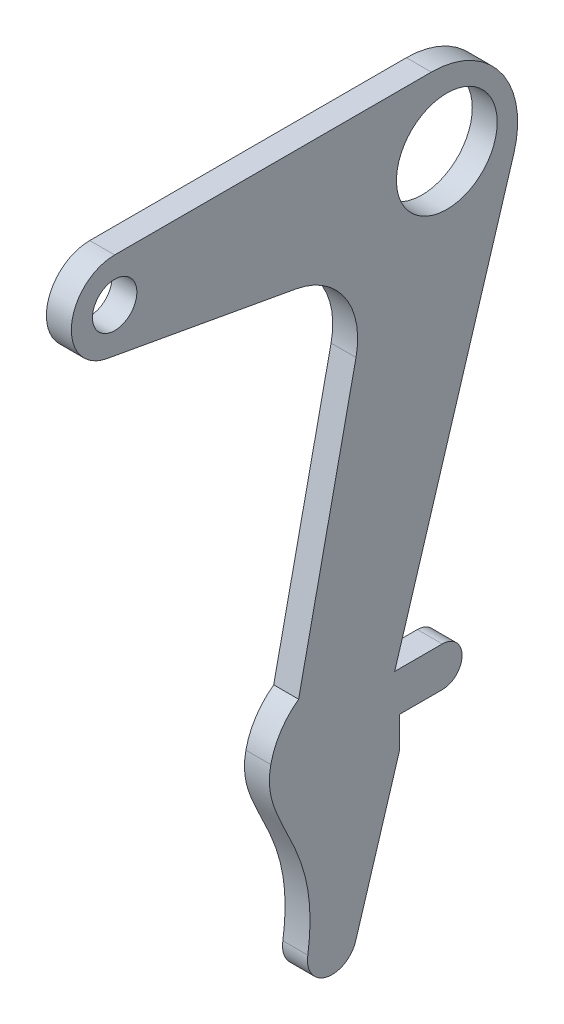
ISO-10303-21;
HEADER;
FILE_DESCRIPTION(('STEP AP214'),'2;1');
FILE_NAME('part.step','',(''),(''),'','','');
FILE_SCHEMA(('AUTOMOTIVE_DESIGN { 1 0 10303 214 1 1 1 1 }'));
ENDSEC;
DATA;
#1=APPLICATION_CONTEXT('core data for automotive mechanical design processes');
#2=APPLICATION_PROTOCOL_DEFINITION('international standard','automotive_design',2000,#1);
#3=PRODUCT_CONTEXT('',#1,'mechanical');
#4=PRODUCT('Part','Part','',(#3));
#5=PRODUCT_RELATED_PRODUCT_CATEGORY('part','',(#4));
#6=PRODUCT_DEFINITION_FORMATION('','',#4);
#7=PRODUCT_DEFINITION_CONTEXT('part definition',#1,'design');
#8=PRODUCT_DEFINITION('design','',#6,#7);
#9=PRODUCT_DEFINITION_SHAPE('','',#8);
#10=(LENGTH_UNIT() NAMED_UNIT(*) SI_UNIT(.MILLI.,.METRE.));
#11=(NAMED_UNIT(*) PLANE_ANGLE_UNIT() SI_UNIT($,.RADIAN.));
#12=(NAMED_UNIT(*) SI_UNIT($,.STERADIAN.) SOLID_ANGLE_UNIT());
#13=UNCERTAINTY_MEASURE_WITH_UNIT(LENGTH_MEASURE(1.E-05),#10,'distance_accuracy_value','');
#14=(GEOMETRIC_REPRESENTATION_CONTEXT(3) GLOBAL_UNCERTAINTY_ASSIGNED_CONTEXT((#13)) GLOBAL_UNIT_ASSIGNED_CONTEXT((#10,
#11,#12)) REPRESENTATION_CONTEXT('',''));
#15=CARTESIAN_POINT('',(0.,0.,0.));
#16=DIRECTION('',(0.,0.,1.));
#17=DIRECTION('',(1.,0.,0.));
#18=AXIS2_PLACEMENT_3D('',#15,#16,#17);
#19=CARTESIAN_POINT('',(2.54,-10.9445470475474,15.1229557204025));
#20=DIRECTION('',(-1.,0.,0.));
#21=DIRECTION('',(0.,0.,1.));
#22=AXIS2_PLACEMENT_3D('',#19,#20,#21);
#23=PLANE('',#22);
#24=CARTESIAN_POINT('',(2.54,1.02415763569521,-1.58018979669472));
#25=DIRECTION('',(1.,0.,0.));
#26=DIRECTION('',(0.,0.,-1.));
#27=AXIS2_PLACEMENT_3D('',#24,#25,#26);
#28=CIRCLE('',#27,5.1308);
#29=CARTESIAN_POINT('',(2.54,1.02415763569521,-6.71098979669473));
#30=VERTEX_POINT('',#29);
#31=EDGE_CURVE('E176',#30,#30,#28,.T.);
#32=ORIENTED_EDGE('',*,*,#31,.F.);
#33=EDGE_LOOP('',(#32));
#34=FACE_BOUND('',#33,.T.);
#35=CARTESIAN_POINT('',(2.54,-10.9445470475474,15.1229557204025));
#36=DIRECTION('',(-1.,0.,0.));
#37=DIRECTION('',(0.,0.,1.));
#38=AXIS2_PLACEMENT_3D('',#35,#36,#37);
#39=CIRCLE('',#38,7.62);
#40=CARTESIAN_POINT('',(2.54,-3.44624236430479,13.7665535391666));
#41=VERTEX_POINT('',#40);
#42=CARTESIAN_POINT('',(2.54,-12.5437586475555,7.67265893044847));
#43=VERTEX_POINT('',#42);
#44=EDGE_CURVE('E206',#41,#43,#39,.T.);
#45=ORIENTED_EDGE('',*,*,#44,.T.);
#46=DIRECTION('',(0.,-0.977729237526779,0.209870288714964));
#47=VECTOR('',#46,1.);
#48=CARTESIAN_POINT('',(2.54,-12.5437586475555,7.67265893044847));
#49=LINE('',#48,#47);
#50=CARTESIAN_POINT('',(2.54,-39.7682423643048,13.5164140708828));
#51=VERTEX_POINT('',#50);
#52=EDGE_CURVE('E114',#43,#51,#49,.T.);
#53=ORIENTED_EDGE('',*,*,#52,.T.);
#54=CARTESIAN_POINT('',(2.54,-45.6317526728369,9.26737306283968));
#55=DIRECTION('',(1.,0.,0.));
#56=DIRECTION('',(0.,0.,1.));
#57=AXIS2_PLACEMENT_3D('',#54,#55,#56);
#58=CIRCLE('',#57,7.24120864402443);
#59=CARTESIAN_POINT('',(2.54,-44.1215673632961,16.3493532207575));
#60=VERTEX_POINT('',#59);
#61=EDGE_CURVE('E242',#51,#60,#58,.T.);
#62=ORIENTED_EDGE('',*,*,#61,.T.);
#63=CARTESIAN_POINT('',(2.54,-44.1215673632961,16.3493532207575));
#64=CARTESIAN_POINT('',(2.54,-49.6498731903993,17.5282277813429));
#65=CARTESIAN_POINT('',(2.54,-52.6752905741128,11.082221768751));
#66=CARTESIAN_POINT('',(2.54,-62.8206542039674,12.581554006208));
#67=B_SPLINE_CURVE_WITH_KNOTS('',3,(#63,#64,#65,#66),.UNSPECIFIED.,.F.,.F.,(4,4),(0.,1.),.UNSPECIFIED.);
#68=CARTESIAN_POINT('',(2.54,-62.8206542039674,12.581554006208));
#69=VERTEX_POINT('',#68);
#70=EDGE_CURVE('E261',#60,#69,#67,.T.);
#71=ORIENTED_EDGE('',*,*,#70,.T.);
#72=CARTESIAN_POINT('',(2.54,-63.2593902703144,10.1055241549973));
#73=DIRECTION('',(1.,0.,0.));
#74=DIRECTION('',(0.,0.,-1.));
#75=AXIS2_PLACEMENT_3D('',#72,#73,#74);
#76=CIRCLE('',#75,2.5146);
#77=CARTESIAN_POINT('',(2.54,-63.9960579975812,7.7012500816846));
#78=VERTEX_POINT('',#77);
#79=EDGE_CURVE('E258',#69,#78,#76,.T.);
#80=ORIENTED_EDGE('',*,*,#79,.T.);
#81=DIRECTION('',(0.,0.956125854335754,-0.292956226543701));
#82=VECTOR('',#81,1.);
#83=CARTESIAN_POINT('',(2.54,-49.5218423643048,3.26636154177543));
#84=LINE('',#83,#82);
#85=CARTESIAN_POINT('',(2.54,-49.5218423643048,3.26636154177543));
#86=VERTEX_POINT('',#85);
#87=EDGE_CURVE('E260',#78,#86,#84,.T.);
#88=ORIENTED_EDGE('',*,*,#87,.T.);
#89=DIRECTION('',(0.,1.,0.));
#90=VECTOR('',#89,1.);
#91=CARTESIAN_POINT('',(2.54,-46.2452423643048,3.26636154177543));
#92=LINE('',#91,#90);
#93=CARTESIAN_POINT('',(2.54,-46.2452423643048,3.26636154177543));
#94=VERTEX_POINT('',#93);
#95=EDGE_CURVE('E263',#86,#94,#92,.T.);
#96=ORIENTED_EDGE('',*,*,#95,.T.);
#97=DIRECTION('',(0.,0.,-1.));
#98=VECTOR('',#97,1.);
#99=CARTESIAN_POINT('',(2.54,-46.2452423643048,-1.11513845822457));
#100=LINE('',#99,#98);
#101=CARTESIAN_POINT('',(2.54,-46.2452423643048,-1.11513845822457));
#102=VERTEX_POINT('',#101);
#103=EDGE_CURVE('E272',#94,#102,#100,.T.);
#104=ORIENTED_EDGE('',*,*,#103,.T.);
#105=CARTESIAN_POINT('',(2.54,-44.2259423643048,-1.11513845822457));
#106=DIRECTION('',(1.,0.,0.));
#107=DIRECTION('',(0.,0.,1.));
#108=AXIS2_PLACEMENT_3D('',#105,#106,#107);
#109=CIRCLE('',#108,2.0193);
#110=CARTESIAN_POINT('',(2.54,-42.2066423643048,-1.11513845822457));
#111=VERTEX_POINT('',#110);
#112=EDGE_CURVE('E274',#102,#111,#109,.T.);
#113=ORIENTED_EDGE('',*,*,#112,.T.);
#114=DIRECTION('',(0.,0.,1.));
#115=VECTOR('',#114,1.);
#116=CARTESIAN_POINT('',(2.54,-42.2066423643048,3.73187382210256));
#117=LINE('',#116,#115);
#118=CARTESIAN_POINT('',(2.54,-42.2066423643048,3.73187382210256));
#119=VERTEX_POINT('',#118);
#120=EDGE_CURVE('E276',#111,#119,#117,.T.);
#121=ORIENTED_EDGE('',*,*,#120,.T.);
#122=DIRECTION('',(0.,0.956125854335754,-0.292956226543701));
#123=VECTOR('',#122,1.);
#124=CARTESIAN_POINT('',(2.54,-2.57700633152745,-8.41061618464278));
#125=LINE('',#124,#123);
#126=CARTESIAN_POINT('',(2.54,-2.57700633152745,-8.41061618464278));
#127=VERTEX_POINT('',#126);
#128=EDGE_CURVE('E278',#119,#127,#125,.T.);
#129=ORIENTED_EDGE('',*,*,#128,.T.);
#130=CARTESIAN_POINT('',(2.54,0.,0.));
#131=DIRECTION('',(1.,0.,0.));
#132=DIRECTION('',(0.,0.,1.));
#133=AXIS2_PLACEMENT_3D('',#130,#131,#132);
#134=CIRCLE('',#133,8.79655763569521);
#135=CARTESIAN_POINT('',(2.54,8.79655763569521,0.));
#136=VERTEX_POINT('',#135);
#137=EDGE_CURVE('E154',#127,#136,#134,.T.);
#138=ORIENTED_EDGE('',*,*,#137,.T.);
#139=DIRECTION('',(0.,0.,1.));
#140=VECTOR('',#139,1.);
#141=CARTESIAN_POINT('',(2.54,8.79655763569521,32.2561923643048));
#142=LINE('',#141,#140);
#143=CARTESIAN_POINT('',(2.54,8.79655763569521,32.2561923643048));
#144=VERTEX_POINT('',#143);
#145=EDGE_CURVE('E148',#136,#144,#142,.T.);
#146=ORIENTED_EDGE('',*,*,#145,.T.);
#147=CARTESIAN_POINT('',(2.54,4.38330763569521,32.2561923643048));
#148=DIRECTION('',(1.,0.,0.));
#149=DIRECTION('',(0.,0.,1.));
#150=AXIS2_PLACEMENT_3D('',#147,#148,#149);
#151=CIRCLE('',#150,4.41325);
#152=CARTESIAN_POINT('',(2.54,0.0405395066505202,33.0417752942706));
#153=VERTEX_POINT('',#152);
#154=EDGE_CURVE('E152',#144,#153,#151,.T.);
#155=ORIENTED_EDGE('',*,*,#154,.T.);
#156=DIRECTION('',(0.,-0.178005535595269,-0.984029485989847));
#157=VECTOR('',#156,1.);
#158=CARTESIAN_POINT('',(2.54,0.0405395066505202,33.0417752942706));
#159=LINE('',#158,#157);
#160=EDGE_CURVE('E50',#153,#41,#159,.T.);
#161=ORIENTED_EDGE('',*,*,#160,.T.);
#162=EDGE_LOOP('',(#45,#53,#62,#71,#80,#88,#96,#104,#113,#121,#129,#138,#146,#155,#161));
#163=FACE_BOUND('',#162,.T.);
#164=CARTESIAN_POINT('',(2.54,4.38330763569521,32.2561923643048));
#165=DIRECTION('',(1.,0.,0.));
#166=DIRECTION('',(0.,0.,-1.));
#167=AXIS2_PLACEMENT_3D('',#164,#165,#166);
#168=CIRCLE('',#167,2.26201088204937);
#169=CARTESIAN_POINT('',(2.54,4.38330763569521,29.9941814822554));
#170=VERTEX_POINT('',#169);
#171=EDGE_CURVE('E321',#170,#170,#168,.T.);
#172=ORIENTED_EDGE('',*,*,#171,.F.);
#173=EDGE_LOOP('',(#172));
#174=FACE_BOUND('',#173,.T.);
#175=ADVANCED_FACE('F33',(#34,#163,#174),#23,.F.);
#176=CARTESIAN_POINT('',(0.,-10.9445470475474,15.1229557204025));
#177=DIRECTION('',(-1.,0.,0.));
#178=DIRECTION('',(0.,0.,1.));
#179=AXIS2_PLACEMENT_3D('',#176,#177,#178);
#180=PLANE('',#179);
#181=CARTESIAN_POINT('',(0.,1.02415763569521,-1.58018979669472));
#182=DIRECTION('',(1.,0.,0.));
#183=DIRECTION('',(0.,0.,-1.));
#184=AXIS2_PLACEMENT_3D('',#181,#182,#183);
#185=CIRCLE('',#184,5.1308);
#186=CARTESIAN_POINT('',(0.,1.02415763569521,-6.71098979669473));
#187=VERTEX_POINT('',#186);
#188=EDGE_CURVE('E326',#187,#187,#185,.T.);
#189=ORIENTED_EDGE('',*,*,#188,.T.);
#190=EDGE_LOOP('',(#189));
#191=FACE_BOUND('',#190,.T.);
#192=CARTESIAN_POINT('',(0.,-10.9445470475474,15.1229557204025));
#193=DIRECTION('',(-1.,0.,0.));
#194=DIRECTION('',(0.,0.,1.));
#195=AXIS2_PLACEMENT_3D('',#192,#193,#194);
#196=CIRCLE('',#195,7.62);
#197=CARTESIAN_POINT('',(0.,-3.44624236430479,13.7665535391666));
#198=VERTEX_POINT('',#197);
#199=CARTESIAN_POINT('',(0.,-12.5437586475555,7.67265893044847));
#200=VERTEX_POINT('',#199);
#201=EDGE_CURVE('E172',#198,#200,#196,.T.);
#202=ORIENTED_EDGE('',*,*,#201,.F.);
#203=DIRECTION('',(0.,-0.178005535595269,-0.984029485989847));
#204=VECTOR('',#203,1.);
#205=CARTESIAN_POINT('',(0.,0.0405395066505202,33.0417752942706));
#206=LINE('',#205,#204);
#207=CARTESIAN_POINT('',(0.,0.0405395066505202,33.0417752942706));
#208=VERTEX_POINT('',#207);
#209=EDGE_CURVE('E106',#208,#198,#206,.T.);
#210=ORIENTED_EDGE('',*,*,#209,.F.);
#211=CARTESIAN_POINT('',(0.,4.38330763569521,32.2561923643048));
#212=DIRECTION('',(1.,0.,0.));
#213=DIRECTION('',(0.,0.,1.));
#214=AXIS2_PLACEMENT_3D('',#211,#212,#213);
#215=CIRCLE('',#214,4.41325);
#216=CARTESIAN_POINT('',(0.,8.79655763569521,32.2561923643048));
#217=VERTEX_POINT('',#216);
#218=EDGE_CURVE('E100',#217,#208,#215,.T.);
#219=ORIENTED_EDGE('',*,*,#218,.F.);
#220=DIRECTION('',(0.,0.,1.));
#221=VECTOR('',#220,1.);
#222=CARTESIAN_POINT('',(0.,8.79655763569521,32.2561923643048));
#223=LINE('',#222,#221);
#224=CARTESIAN_POINT('',(0.,8.79655763569521,0.));
#225=VERTEX_POINT('',#224);
#226=EDGE_CURVE('E162',#225,#217,#223,.T.);
#227=ORIENTED_EDGE('',*,*,#226,.F.);
#228=CARTESIAN_POINT('',(0.,0.,0.));
#229=DIRECTION('',(1.,0.,0.));
#230=DIRECTION('',(0.,0.,1.));
#231=AXIS2_PLACEMENT_3D('',#228,#229,#230);
#232=CIRCLE('',#231,8.79655763569521);
#233=CARTESIAN_POINT('',(0.,-2.57700633152745,-8.41061618464278));
#234=VERTEX_POINT('',#233);
#235=EDGE_CURVE('E201',#234,#225,#232,.T.);
#236=ORIENTED_EDGE('',*,*,#235,.F.);
#237=DIRECTION('',(0.,0.956125854335754,-0.292956226543701));
#238=VECTOR('',#237,1.);
#239=CARTESIAN_POINT('',(0.,-2.57700633152745,-8.41061618464278));
#240=LINE('',#239,#238);
#241=CARTESIAN_POINT('',(0.,-42.2066423643048,3.73187382210256));
#242=VERTEX_POINT('',#241);
#243=EDGE_CURVE('E199',#242,#234,#240,.T.);
#244=ORIENTED_EDGE('',*,*,#243,.F.);
#245=DIRECTION('',(0.,0.,1.));
#246=VECTOR('',#245,1.);
#247=CARTESIAN_POINT('',(0.,-42.2066423643048,3.73187382210256));
#248=LINE('',#247,#246);
#249=CARTESIAN_POINT('',(0.,-42.2066423643048,-1.11513845822457));
#250=VERTEX_POINT('',#249);
#251=EDGE_CURVE('E197',#250,#242,#248,.T.);
#252=ORIENTED_EDGE('',*,*,#251,.F.);
#253=CARTESIAN_POINT('',(0.,-44.2259423643048,-1.11513845822457));
#254=DIRECTION('',(1.,0.,0.));
#255=DIRECTION('',(0.,0.,1.));
#256=AXIS2_PLACEMENT_3D('',#253,#254,#255);
#257=CIRCLE('',#256,2.0193);
#258=CARTESIAN_POINT('',(0.,-46.2452423643048,-1.11513845822457));
#259=VERTEX_POINT('',#258);
#260=EDGE_CURVE('E195',#259,#250,#257,.T.);
#261=ORIENTED_EDGE('',*,*,#260,.F.);
#262=DIRECTION('',(0.,0.,-1.));
#263=VECTOR('',#262,1.);
#264=CARTESIAN_POINT('',(0.,-46.2452423643048,-1.11513845822457));
#265=LINE('',#264,#263);
#266=CARTESIAN_POINT('',(0.,-46.2452423643048,3.26636154177543));
#267=VERTEX_POINT('',#266);
#268=EDGE_CURVE('E193',#267,#259,#265,.T.);
#269=ORIENTED_EDGE('',*,*,#268,.F.);
#270=DIRECTION('',(0.,1.,0.));
#271=VECTOR('',#270,1.);
#272=CARTESIAN_POINT('',(0.,-46.2452423643048,3.26636154177543));
#273=LINE('',#272,#271);
#274=CARTESIAN_POINT('',(0.,-49.5218423643048,3.26636154177543));
#275=VERTEX_POINT('',#274);
#276=EDGE_CURVE('E191',#275,#267,#273,.T.);
#277=ORIENTED_EDGE('',*,*,#276,.F.);
#278=DIRECTION('',(0.,0.956125854335754,-0.292956226543701));
#279=VECTOR('',#278,1.);
#280=CARTESIAN_POINT('',(0.,-49.5218423643048,3.26636154177543));
#281=LINE('',#280,#279);
#282=CARTESIAN_POINT('',(0.,-63.9960579975812,7.7012500816846));
#283=VERTEX_POINT('',#282);
#284=EDGE_CURVE('E189',#283,#275,#281,.T.);
#285=ORIENTED_EDGE('',*,*,#284,.F.);
#286=CARTESIAN_POINT('',(0.,-63.2593902703144,10.1055241549973));
#287=DIRECTION('',(1.,0.,0.));
#288=DIRECTION('',(0.,0.,-1.));
#289=AXIS2_PLACEMENT_3D('',#286,#287,#288);
#290=CIRCLE('',#289,2.5146);
#291=CARTESIAN_POINT('',(0.,-62.8206542039674,12.581554006208));
#292=VERTEX_POINT('',#291);
#293=EDGE_CURVE('E184',#292,#283,#290,.T.);
#294=ORIENTED_EDGE('',*,*,#293,.F.);
#295=CARTESIAN_POINT('',(0.,-44.1215673632961,16.3493532207575));
#296=CARTESIAN_POINT('',(0.,-49.6498731903993,17.5282277813429));
#297=CARTESIAN_POINT('',(0.,-52.6752905741128,11.082221768751));
#298=CARTESIAN_POINT('',(0.,-62.8206542039674,12.581554006208));
#299=B_SPLINE_CURVE_WITH_KNOTS('',3,(#295,#296,#297,#298),.UNSPECIFIED.,.F.,.F.,(4,4),(0.,1.),.UNSPECIFIED.);
#300=CARTESIAN_POINT('',(0.,-44.1215673632961,16.3493532207575));
#301=VERTEX_POINT('',#300);
#302=EDGE_CURVE('E180',#301,#292,#299,.T.);
#303=ORIENTED_EDGE('',*,*,#302,.F.);
#304=CARTESIAN_POINT('',(0.,-45.6317526728369,9.26737306283968));
#305=DIRECTION('',(1.,0.,0.));
#306=DIRECTION('',(0.,0.,1.));
#307=AXIS2_PLACEMENT_3D('',#304,#305,#306);
#308=CIRCLE('',#307,7.24120864402443);
#309=CARTESIAN_POINT('',(0.,-39.7682423643048,13.5164140708828));
#310=VERTEX_POINT('',#309);
#311=EDGE_CURVE('E178',#310,#301,#308,.T.);
#312=ORIENTED_EDGE('',*,*,#311,.F.);
#313=DIRECTION('',(0.,-0.977729237526779,0.209870288714964));
#314=VECTOR('',#313,1.);
#315=CARTESIAN_POINT('',(0.,-12.5437586475555,7.67265893044847));
#316=LINE('',#315,#314);
#317=EDGE_CURVE('E175',#200,#310,#316,.T.);
#318=ORIENTED_EDGE('',*,*,#317,.F.);
#319=EDGE_LOOP('',(#202,#210,#219,#227,#236,#244,#252,#261,#269,#277,#285,#294,#303,#312,#318));
#320=FACE_BOUND('',#319,.T.);
#321=CARTESIAN_POINT('',(0.,4.38330763569521,32.2561923643048));
#322=DIRECTION('',(1.,0.,0.));
#323=DIRECTION('',(0.,0.,-1.));
#324=AXIS2_PLACEMENT_3D('',#321,#322,#323);
#325=CIRCLE('',#324,2.26201088204937);
#326=CARTESIAN_POINT('',(0.,4.38330763569521,29.9941814822554));
#327=VERTEX_POINT('',#326);
#328=EDGE_CURVE('E324',#327,#327,#325,.T.);
#329=ORIENTED_EDGE('',*,*,#328,.T.);
#330=EDGE_LOOP('',(#329));
#331=FACE_BOUND('',#330,.T.);
#332=ADVANCED_FACE('F246',(#191,#320,#331),#180,.T.);
#333=CARTESIAN_POINT('',(2.54,-10.9445470475474,15.1229557204025));
#334=DIRECTION('',(-1.,0.,0.));
#335=DIRECTION('',(0.,0.,1.));
#336=AXIS2_PLACEMENT_3D('',#333,#334,#335);
#337=CYLINDRICAL_SURFACE('',#336,7.62);
#338=ORIENTED_EDGE('',*,*,#201,.T.);
#339=DIRECTION('',(-1.,0.,0.));
#340=VECTOR('',#339,1.);
#341=CARTESIAN_POINT('',(2.54,-12.5437586475555,7.67265893044847));
#342=LINE('',#341,#340);
#343=EDGE_CURVE('E11',#43,#200,#342,.T.);
#344=ORIENTED_EDGE('',*,*,#343,.F.);
#345=ORIENTED_EDGE('',*,*,#44,.F.);
#346=DIRECTION('',(-1.,0.,0.));
#347=VECTOR('',#346,1.);
#348=CARTESIAN_POINT('',(2.54,-3.44624236430479,13.7665535391666));
#349=LINE('',#348,#347);
#350=EDGE_CURVE('E168',#41,#198,#349,.T.);
#351=ORIENTED_EDGE('',*,*,#350,.T.);
#352=EDGE_LOOP('',(#338,#344,#345,#351));
#353=FACE_BOUND('',#352,.T.);
#354=ADVANCED_FACE('F35',(#353),#337,.F.);
#355=CARTESIAN_POINT('',(2.54,-12.5437586475555,7.67265893044847));
#356=DIRECTION('',(0.,-0.209870288714964,-0.977729237526779));
#357=DIRECTION('',(0.,0.977729237526779,-0.209870288714964));
#358=AXIS2_PLACEMENT_3D('',#355,#356,#357);
#359=PLANE('',#358);
#360=ORIENTED_EDGE('',*,*,#317,.T.);
#361=DIRECTION('',(-1.,0.,0.));
#362=VECTOR('',#361,1.);
#363=CARTESIAN_POINT('',(2.54,-39.7682423643048,13.5164140708828));
#364=LINE('',#363,#362);
#365=EDGE_CURVE('E42',#51,#310,#364,.T.);
#366=ORIENTED_EDGE('',*,*,#365,.F.);
#367=ORIENTED_EDGE('',*,*,#52,.F.);
#368=ORIENTED_EDGE('',*,*,#343,.T.);
#369=EDGE_LOOP('',(#360,#366,#367,#368));
#370=FACE_BOUND('',#369,.T.);
#371=ADVANCED_FACE('F449',(#370),#359,.F.);
#372=CARTESIAN_POINT('',(2.54,-45.6317526728369,9.26737306283968));
#373=DIRECTION('',(-1.,0.,0.));
#374=DIRECTION('',(0.,0.,1.));
#375=AXIS2_PLACEMENT_3D('',#372,#373,#374);
#376=CYLINDRICAL_SURFACE('',#375,7.24120864402443);
#377=ORIENTED_EDGE('',*,*,#311,.T.);
#378=DIRECTION('',(-1.,0.,0.));
#379=VECTOR('',#378,1.);
#380=CARTESIAN_POINT('',(2.54,-44.1215673632961,16.3493532207575));
#381=LINE('',#380,#379);
#382=EDGE_CURVE('E234',#60,#301,#381,.T.);
#383=ORIENTED_EDGE('',*,*,#382,.F.);
#384=ORIENTED_EDGE('',*,*,#61,.F.);
#385=ORIENTED_EDGE('',*,*,#365,.T.);
#386=EDGE_LOOP('',(#377,#383,#384,#385));
#387=FACE_BOUND('',#386,.T.);
#388=ADVANCED_FACE('F240',(#387),#376,.T.);
#389=DIRECTION('',(-1.,0.,0.));
#390=VECTOR('',#389,1.);
#391=SURFACE_OF_LINEAR_EXTRUSION('',#67,#390);
#392=ORIENTED_EDGE('',*,*,#302,.T.);
#393=DIRECTION('',(-1.,0.,0.));
#394=VECTOR('',#393,1.);
#395=CARTESIAN_POINT('',(2.54,-62.8206542039674,12.581554006208));
#396=LINE('',#395,#394);
#397=EDGE_CURVE('E231',#69,#292,#396,.T.);
#398=ORIENTED_EDGE('',*,*,#397,.F.);
#399=ORIENTED_EDGE('',*,*,#70,.F.);
#400=ORIENTED_EDGE('',*,*,#382,.T.);
#401=EDGE_LOOP('',(#392,#398,#399,#400));
#402=FACE_BOUND('',#401,.T.);
#403=ADVANCED_FACE('F252',(#402),#391,.F.);
#404=CARTESIAN_POINT('',(2.54,-63.2593902703144,10.1055241549973));
#405=DIRECTION('',(-1.,0.,0.));
#406=DIRECTION('',(0.,0.,1.));
#407=AXIS2_PLACEMENT_3D('',#404,#405,#406);
#408=CYLINDRICAL_SURFACE('',#407,2.5146);
#409=ORIENTED_EDGE('',*,*,#293,.T.);
#410=DIRECTION('',(-1.,0.,0.));
#411=VECTOR('',#410,1.);
#412=CARTESIAN_POINT('',(2.54,-63.9960579975812,7.7012500816846));
#413=LINE('',#412,#411);
#414=EDGE_CURVE('E228',#78,#283,#413,.T.);
#415=ORIENTED_EDGE('',*,*,#414,.F.);
#416=ORIENTED_EDGE('',*,*,#79,.F.);
#417=ORIENTED_EDGE('',*,*,#397,.T.);
#418=EDGE_LOOP('',(#409,#415,#416,#417));
#419=FACE_BOUND('',#418,.T.);
#420=ADVANCED_FACE('F256',(#419),#408,.T.);
#421=CARTESIAN_POINT('',(2.54,-49.5218423643048,3.26636154177543));
#422=DIRECTION('',(0.,0.292956226543701,0.956125854335754));
#423=DIRECTION('',(0.,-0.956125854335754,0.292956226543701));
#424=AXIS2_PLACEMENT_3D('',#421,#422,#423);
#425=PLANE('',#424);
#426=ORIENTED_EDGE('',*,*,#284,.T.);
#427=DIRECTION('',(-1.,0.,0.));
#428=VECTOR('',#427,1.);
#429=CARTESIAN_POINT('',(2.54,-49.5218423643048,3.26636154177543));
#430=LINE('',#429,#428);
#431=EDGE_CURVE('E225',#86,#275,#430,.T.);
#432=ORIENTED_EDGE('',*,*,#431,.F.);
#433=ORIENTED_EDGE('',*,*,#87,.F.);
#434=ORIENTED_EDGE('',*,*,#414,.T.);
#435=EDGE_LOOP('',(#426,#432,#433,#434));
#436=FACE_BOUND('',#435,.T.);
#437=ADVANCED_FACE('F414',(#436),#425,.F.);
#438=CARTESIAN_POINT('',(2.54,-46.2452423643048,3.26636154177543));
#439=DIRECTION('',(0.,0.,1.));
#440=DIRECTION('',(0.,-1.,0.));
#441=AXIS2_PLACEMENT_3D('',#438,#439,#440);
#442=PLANE('',#441);
#443=ORIENTED_EDGE('',*,*,#276,.T.);
#444=DIRECTION('',(-1.,0.,0.));
#445=VECTOR('',#444,1.);
#446=CARTESIAN_POINT('',(2.54,-46.2452423643048,3.26636154177543));
#447=LINE('',#446,#445);
#448=EDGE_CURVE('E222',#94,#267,#447,.T.);
#449=ORIENTED_EDGE('',*,*,#448,.F.);
#450=ORIENTED_EDGE('',*,*,#95,.F.);
#451=ORIENTED_EDGE('',*,*,#431,.T.);
#452=EDGE_LOOP('',(#443,#449,#450,#451));
#453=FACE_BOUND('',#452,.T.);
#454=ADVANCED_FACE('F404',(#453),#442,.F.);
#455=CARTESIAN_POINT('',(2.54,-46.2452423643048,-1.11513845822457));
#456=DIRECTION('',(0.,1.,0.));
#457=DIRECTION('',(0.,0.,1.));
#458=AXIS2_PLACEMENT_3D('',#455,#456,#457);
#459=PLANE('',#458);
#460=ORIENTED_EDGE('',*,*,#268,.T.);
#461=DIRECTION('',(-1.,0.,0.));
#462=VECTOR('',#461,1.);
#463=CARTESIAN_POINT('',(2.54,-46.2452423643048,-1.11513845822457));
#464=LINE('',#463,#462);
#465=EDGE_CURVE('E219',#102,#259,#464,.T.);
#466=ORIENTED_EDGE('',*,*,#465,.F.);
#467=ORIENTED_EDGE('',*,*,#103,.F.);
#468=ORIENTED_EDGE('',*,*,#448,.T.);
#469=EDGE_LOOP('',(#460,#466,#467,#468));
#470=FACE_BOUND('',#469,.T.);
#471=ADVANCED_FACE('F394',(#470),#459,.F.);
#472=CARTESIAN_POINT('',(2.54,-44.2259423643048,-1.11513845822457));
#473=DIRECTION('',(-1.,0.,0.));
#474=DIRECTION('',(0.,0.,1.));
#475=AXIS2_PLACEMENT_3D('',#472,#473,#474);
#476=CYLINDRICAL_SURFACE('',#475,2.0193);
#477=ORIENTED_EDGE('',*,*,#260,.T.);
#478=DIRECTION('',(-1.,0.,0.));
#479=VECTOR('',#478,1.);
#480=CARTESIAN_POINT('',(2.54,-42.2066423643048,-1.11513845822457));
#481=LINE('',#480,#479);
#482=EDGE_CURVE('E216',#111,#250,#481,.T.);
#483=ORIENTED_EDGE('',*,*,#482,.F.);
#484=ORIENTED_EDGE('',*,*,#112,.F.);
#485=ORIENTED_EDGE('',*,*,#465,.T.);
#486=EDGE_LOOP('',(#477,#483,#484,#485));
#487=FACE_BOUND('',#486,.T.);
#488=ADVANCED_FACE('F384',(#487),#476,.T.);
#489=CARTESIAN_POINT('',(2.54,-42.2066423643048,3.73187382210256));
#490=DIRECTION('',(0.,-1.,0.));
#491=DIRECTION('',(0.,0.,-1.));
#492=AXIS2_PLACEMENT_3D('',#489,#490,#491);
#493=PLANE('',#492);
#494=ORIENTED_EDGE('',*,*,#251,.T.);
#495=DIRECTION('',(-1.,0.,0.));
#496=VECTOR('',#495,1.);
#497=CARTESIAN_POINT('',(2.54,-42.2066423643048,3.73187382210256));
#498=LINE('',#497,#496);
#499=EDGE_CURVE('E213',#119,#242,#498,.T.);
#500=ORIENTED_EDGE('',*,*,#499,.F.);
#501=ORIENTED_EDGE('',*,*,#120,.F.);
#502=ORIENTED_EDGE('',*,*,#482,.T.);
#503=EDGE_LOOP('',(#494,#500,#501,#502));
#504=FACE_BOUND('',#503,.T.);
#505=ADVANCED_FACE('F375',(#504),#493,.F.);
#506=CARTESIAN_POINT('',(2.54,-2.57700633152745,-8.41061618464278));
#507=DIRECTION('',(0.,0.292956226543701,0.956125854335754));
#508=DIRECTION('',(0.,-0.956125854335754,0.292956226543701));
#509=AXIS2_PLACEMENT_3D('',#506,#507,#508);
#510=PLANE('',#509);
#511=ORIENTED_EDGE('',*,*,#243,.T.);
#512=DIRECTION('',(-1.,0.,0.));
#513=VECTOR('',#512,1.);
#514=CARTESIAN_POINT('',(2.54,-2.57700633152745,-8.41061618464278));
#515=LINE('',#514,#513);
#516=EDGE_CURVE('E210',#127,#234,#515,.T.);
#517=ORIENTED_EDGE('',*,*,#516,.F.);
#518=ORIENTED_EDGE('',*,*,#128,.F.);
#519=ORIENTED_EDGE('',*,*,#499,.T.);
#520=EDGE_LOOP('',(#511,#517,#518,#519));
#521=FACE_BOUND('',#520,.T.);
#522=ADVANCED_FACE('F284',(#521),#510,.F.);
#523=CARTESIAN_POINT('',(2.54,0.,0.));
#524=DIRECTION('',(-1.,0.,0.));
#525=DIRECTION('',(0.,0.,1.));
#526=AXIS2_PLACEMENT_3D('',#523,#524,#525);
#527=CYLINDRICAL_SURFACE('',#526,8.79655763569521);
#528=ORIENTED_EDGE('',*,*,#235,.T.);
#529=DIRECTION('',(-1.,0.,0.));
#530=VECTOR('',#529,1.);
#531=CARTESIAN_POINT('',(2.54,8.79655763569521,0.));
#532=LINE('',#531,#530);
#533=EDGE_CURVE('E163',#136,#225,#532,.T.);
#534=ORIENTED_EDGE('',*,*,#533,.F.);
#535=ORIENTED_EDGE('',*,*,#137,.F.);
#536=ORIENTED_EDGE('',*,*,#516,.T.);
#537=EDGE_LOOP('',(#528,#534,#535,#536));
#538=FACE_BOUND('',#537,.T.);
#539=ADVANCED_FACE('F288',(#538),#527,.T.);
#540=CARTESIAN_POINT('',(2.54,8.79655763569521,32.2561923643048));
#541=DIRECTION('',(0.,-1.,0.));
#542=DIRECTION('',(0.,0.,-1.));
#543=AXIS2_PLACEMENT_3D('',#540,#541,#542);
#544=PLANE('',#543);
#545=ORIENTED_EDGE('',*,*,#226,.T.);
#546=DIRECTION('',(-1.,0.,0.));
#547=VECTOR('',#546,1.);
#548=CARTESIAN_POINT('',(2.54,8.79655763569521,32.2561923643048));
#549=LINE('',#548,#547);
#550=EDGE_CURVE('E159',#144,#217,#549,.T.);
#551=ORIENTED_EDGE('',*,*,#550,.F.);
#552=ORIENTED_EDGE('',*,*,#145,.F.);
#553=ORIENTED_EDGE('',*,*,#533,.T.);
#554=EDGE_LOOP('',(#545,#551,#552,#553));
#555=FACE_BOUND('',#554,.T.);
#556=ADVANCED_FACE('F160',(#555),#544,.F.);
#557=CARTESIAN_POINT('',(2.54,4.38330763569521,32.2561923643048));
#558=DIRECTION('',(-1.,0.,0.));
#559=DIRECTION('',(0.,0.,1.));
#560=AXIS2_PLACEMENT_3D('',#557,#558,#559);
#561=CYLINDRICAL_SURFACE('',#560,4.41325);
#562=ORIENTED_EDGE('',*,*,#218,.T.);
#563=DIRECTION('',(-1.,0.,0.));
#564=VECTOR('',#563,1.);
#565=CARTESIAN_POINT('',(2.54,0.0405395066505202,33.0417752942706));
#566=LINE('',#565,#564);
#567=EDGE_CURVE('E164',#153,#208,#566,.T.);
#568=ORIENTED_EDGE('',*,*,#567,.F.);
#569=ORIENTED_EDGE('',*,*,#154,.F.);
#570=ORIENTED_EDGE('',*,*,#550,.T.);
#571=EDGE_LOOP('',(#562,#568,#569,#570));
#572=FACE_BOUND('',#571,.T.);
#573=ADVANCED_FACE('F166',(#572),#561,.T.);
#574=CARTESIAN_POINT('',(2.54,0.0405395066505202,33.0417752942706));
#575=DIRECTION('',(0.,0.984029485989846,-0.178005535595269));
#576=DIRECTION('',(0.,0.178005535595269,0.984029485989847));
#577=AXIS2_PLACEMENT_3D('',#574,#575,#576);
#578=PLANE('',#577);
#579=ORIENTED_EDGE('',*,*,#209,.T.);
#580=ORIENTED_EDGE('',*,*,#350,.F.);
#581=ORIENTED_EDGE('',*,*,#160,.F.);
#582=ORIENTED_EDGE('',*,*,#567,.T.);
#583=EDGE_LOOP('',(#579,#580,#581,#582));
#584=FACE_BOUND('',#583,.T.);
#585=ADVANCED_FACE('F292',(#584),#578,.F.);
#586=CARTESIAN_POINT('',(2.54,1.02415763569521,-1.58018979669472));
#587=DIRECTION('',(-1.,0.,0.));
#588=DIRECTION('',(0.,0.,1.));
#589=AXIS2_PLACEMENT_3D('',#586,#587,#588);
#590=CYLINDRICAL_SURFACE('',#589,5.1308);
#591=ORIENTED_EDGE('',*,*,#31,.T.);
#592=EDGE_LOOP('',(#591));
#593=FACE_BOUND('',#592,.T.);
#594=ORIENTED_EDGE('',*,*,#188,.F.);
#595=EDGE_LOOP('',(#594));
#596=FACE_BOUND('',#595,.T.);
#597=ADVANCED_FACE('F294',(#593,#596),#590,.F.);
#598=CARTESIAN_POINT('',(2.54,4.38330763569521,32.2561923643048));
#599=DIRECTION('',(-1.,0.,0.));
#600=DIRECTION('',(0.,0.,1.));
#601=AXIS2_PLACEMENT_3D('',#598,#599,#600);
#602=CYLINDRICAL_SURFACE('',#601,2.26201088204937);
#603=ORIENTED_EDGE('',*,*,#171,.T.);
#604=EDGE_LOOP('',(#603));
#605=FACE_BOUND('',#604,.T.);
#606=ORIENTED_EDGE('',*,*,#328,.F.);
#607=EDGE_LOOP('',(#606));
#608=FACE_BOUND('',#607,.T.);
#609=ADVANCED_FACE('F300',(#605,#608),#602,.F.);
#610=CLOSED_SHELL('',(#175,#332,#354,#371,#388,#403,#420,#437,#454,#471,#488,#505,#522,#539,
#556,#573,#585,#597,#609));
#611=MANIFOLD_SOLID_BREP('B2',#610);
#612=ADVANCED_BREP_SHAPE_REPRESENTATION('',(#18,#611),#14);
#613=SHAPE_DEFINITION_REPRESENTATION(#9,#612);
ENDSEC;
END-ISO-10303-21;
